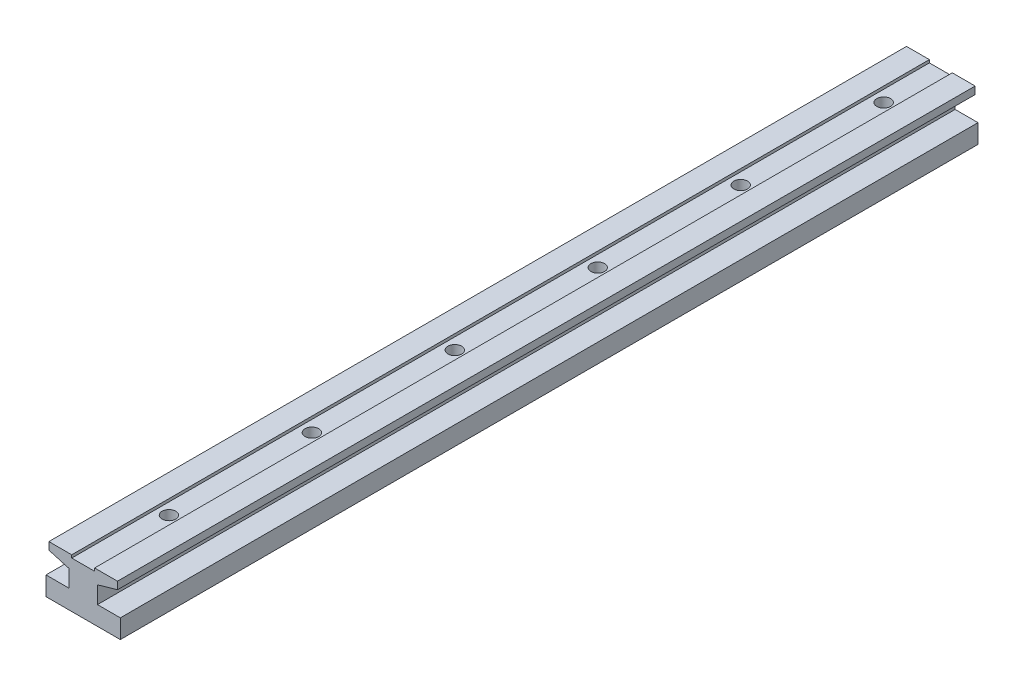
ISO-10303-21;
HEADER;
FILE_DESCRIPTION(('STEP AP214'),'2;1');
FILE_NAME('part.step','',(''),(''),'','','');
FILE_SCHEMA(('AUTOMOTIVE_DESIGN { 1 0 10303 214 1 1 1 1 }'));
ENDSEC;
DATA;
#1=APPLICATION_CONTEXT('core data for automotive mechanical design processes');
#2=APPLICATION_PROTOCOL_DEFINITION('international standard','automotive_design',2000,#1);
#3=PRODUCT_CONTEXT('',#1,'mechanical');
#4=PRODUCT('Part','Part','',(#3));
#5=PRODUCT_RELATED_PRODUCT_CATEGORY('part','',(#4));
#6=PRODUCT_DEFINITION_FORMATION('','',#4);
#7=PRODUCT_DEFINITION_CONTEXT('part definition',#1,'design');
#8=PRODUCT_DEFINITION('design','',#6,#7);
#9=PRODUCT_DEFINITION_SHAPE('','',#8);
#10=(LENGTH_UNIT() NAMED_UNIT(*) SI_UNIT(.MILLI.,.METRE.));
#11=(NAMED_UNIT(*) PLANE_ANGLE_UNIT() SI_UNIT($,.RADIAN.));
#12=(NAMED_UNIT(*) SI_UNIT($,.STERADIAN.) SOLID_ANGLE_UNIT());
#13=UNCERTAINTY_MEASURE_WITH_UNIT(LENGTH_MEASURE(1.E-05),#10,'distance_accuracy_value','');
#14=(GEOMETRIC_REPRESENTATION_CONTEXT(3) GLOBAL_UNCERTAINTY_ASSIGNED_CONTEXT((#13)) GLOBAL_UNIT_ASSIGNED_CONTEXT((#10,
#11,#12)) REPRESENTATION_CONTEXT('',''));
#15=CARTESIAN_POINT('',(0.,0.,0.));
#16=DIRECTION('',(0.,0.,1.));
#17=DIRECTION('',(1.,0.,0.));
#18=AXIS2_PLACEMENT_3D('',#15,#16,#17);
#19=CARTESIAN_POINT('',(6.5,0.,150.));
#20=DIRECTION('',(-1.,0.,0.));
#21=DIRECTION('',(0.,-1.,0.));
#22=AXIS2_PLACEMENT_3D('',#19,#20,#21);
#23=PLANE('',#22);
#24=DIRECTION('',(0.,1.,0.));
#25=VECTOR('',#24,1.);
#26=CARTESIAN_POINT('',(6.5,0.,0.));
#27=LINE('',#26,#25);
#28=CARTESIAN_POINT('',(6.5,0.,0.));
#29=VERTEX_POINT('',#28);
#30=CARTESIAN_POINT('',(6.5,3.3,0.));
#31=VERTEX_POINT('',#30);
#32=EDGE_CURVE('E182',#29,#31,#27,.T.);
#33=ORIENTED_EDGE('',*,*,#32,.T.);
#34=DIRECTION('',(0.,0.,-1.));
#35=VECTOR('',#34,1.);
#36=CARTESIAN_POINT('',(6.5,3.3,150.));
#37=LINE('',#36,#35);
#38=CARTESIAN_POINT('',(6.5,3.3,150.));
#39=VERTEX_POINT('',#38);
#40=EDGE_CURVE('E41',#39,#31,#37,.T.);
#41=ORIENTED_EDGE('',*,*,#40,.F.);
#42=DIRECTION('',(0.,1.,0.));
#43=VECTOR('',#42,1.);
#44=CARTESIAN_POINT('',(6.5,0.,150.));
#45=LINE('',#44,#43);
#46=CARTESIAN_POINT('',(6.5,0.,150.));
#47=VERTEX_POINT('',#46);
#48=EDGE_CURVE('E118',#47,#39,#45,.T.);
#49=ORIENTED_EDGE('',*,*,#48,.F.);
#50=DIRECTION('',(0.,0.,-1.));
#51=VECTOR('',#50,1.);
#52=CARTESIAN_POINT('',(6.5,0.,150.));
#53=LINE('',#52,#51);
#54=EDGE_CURVE('E11',#47,#29,#53,.T.);
#55=ORIENTED_EDGE('',*,*,#54,.T.);
#56=EDGE_LOOP('',(#33,#41,#49,#55));
#57=FACE_BOUND('',#56,.T.);
#58=ADVANCED_FACE('F32',(#57),#23,.F.);
#59=CARTESIAN_POINT('',(6.5,3.3,150.));
#60=DIRECTION('',(0.,-1.,0.));
#61=DIRECTION('',(1.,0.,0.));
#62=AXIS2_PLACEMENT_3D('',#59,#60,#61);
#63=PLANE('',#62);
#64=DIRECTION('',(-1.,0.,0.));
#65=VECTOR('',#64,1.);
#66=CARTESIAN_POINT('',(6.5,3.3,0.));
#67=LINE('',#66,#65);
#68=CARTESIAN_POINT('',(2.5,3.3,0.));
#69=VERTEX_POINT('',#68);
#70=EDGE_CURVE('E184',#31,#69,#67,.T.);
#71=ORIENTED_EDGE('',*,*,#70,.T.);
#72=DIRECTION('',(0.,0.,-1.));
#73=VECTOR('',#72,1.);
#74=CARTESIAN_POINT('',(2.5,3.3,150.));
#75=LINE('',#74,#73);
#76=CARTESIAN_POINT('',(2.5,3.3,150.));
#77=VERTEX_POINT('',#76);
#78=EDGE_CURVE('E242',#77,#69,#75,.T.);
#79=ORIENTED_EDGE('',*,*,#78,.F.);
#80=DIRECTION('',(-1.,0.,0.));
#81=VECTOR('',#80,1.);
#82=CARTESIAN_POINT('',(6.5,3.3,150.));
#83=LINE('',#82,#81);
#84=EDGE_CURVE('E310',#39,#77,#83,.T.);
#85=ORIENTED_EDGE('',*,*,#84,.F.);
#86=ORIENTED_EDGE('',*,*,#40,.T.);
#87=EDGE_LOOP('',(#71,#79,#85,#86));
#88=FACE_BOUND('',#87,.T.);
#89=ADVANCED_FACE('F349',(#88),#63,.F.);
#90=CARTESIAN_POINT('',(2.5,3.3,150.));
#91=DIRECTION('',(-1.,0.,0.));
#92=DIRECTION('',(0.,-1.,0.));
#93=AXIS2_PLACEMENT_3D('',#90,#91,#92);
#94=PLANE('',#93);
#95=DIRECTION('',(0.,1.,0.));
#96=VECTOR('',#95,1.);
#97=CARTESIAN_POINT('',(2.5,3.3,0.));
#98=LINE('',#97,#96);
#99=CARTESIAN_POINT('',(2.5,6.3,0.));
#100=VERTEX_POINT('',#99);
#101=EDGE_CURVE('E187',#69,#100,#98,.T.);
#102=ORIENTED_EDGE('',*,*,#101,.T.);
#103=DIRECTION('',(0.,0.,-1.));
#104=VECTOR('',#103,1.);
#105=CARTESIAN_POINT('',(2.5,6.3,150.));
#106=LINE('',#105,#104);
#107=CARTESIAN_POINT('',(2.5,6.3,150.));
#108=VERTEX_POINT('',#107);
#109=EDGE_CURVE('E239',#108,#100,#106,.T.);
#110=ORIENTED_EDGE('',*,*,#109,.F.);
#111=DIRECTION('',(0.,1.,0.));
#112=VECTOR('',#111,1.);
#113=CARTESIAN_POINT('',(2.5,3.3,150.));
#114=LINE('',#113,#112);
#115=EDGE_CURVE('E312',#77,#108,#114,.T.);
#116=ORIENTED_EDGE('',*,*,#115,.F.);
#117=ORIENTED_EDGE('',*,*,#78,.T.);
#118=EDGE_LOOP('',(#102,#110,#116,#117));
#119=FACE_BOUND('',#118,.T.);
#120=ADVANCED_FACE('F354',(#119),#94,.F.);
#121=CARTESIAN_POINT('',(2.5,6.3,150.));
#122=DIRECTION('',(-0.274721127897378,0.961523947640823,0.));
#123=DIRECTION('',(-0.961523947640823,-0.274721127897378,0.));
#124=AXIS2_PLACEMENT_3D('',#121,#122,#123);
#125=PLANE('',#124);
#126=DIRECTION('',(0.961523947640823,0.274721127897378,0.));
#127=VECTOR('',#126,1.);
#128=CARTESIAN_POINT('',(2.5,6.3,0.));
#129=LINE('',#128,#127);
#130=CARTESIAN_POINT('',(6.,7.3,0.));
#131=VERTEX_POINT('',#130);
#132=EDGE_CURVE('E189',#100,#131,#129,.T.);
#133=ORIENTED_EDGE('',*,*,#132,.T.);
#134=DIRECTION('',(0.,0.,-1.));
#135=VECTOR('',#134,1.);
#136=CARTESIAN_POINT('',(6.,7.3,150.));
#137=LINE('',#136,#135);
#138=CARTESIAN_POINT('',(6.,7.3,150.));
#139=VERTEX_POINT('',#138);
#140=EDGE_CURVE('E236',#139,#131,#137,.T.);
#141=ORIENTED_EDGE('',*,*,#140,.F.);
#142=DIRECTION('',(0.961523947640823,0.274721127897378,0.));
#143=VECTOR('',#142,1.);
#144=CARTESIAN_POINT('',(2.5,6.3,150.));
#145=LINE('',#144,#143);
#146=EDGE_CURVE('E314',#108,#139,#145,.T.);
#147=ORIENTED_EDGE('',*,*,#146,.F.);
#148=ORIENTED_EDGE('',*,*,#109,.T.);
#149=EDGE_LOOP('',(#133,#141,#147,#148));
#150=FACE_BOUND('',#149,.T.);
#151=ADVANCED_FACE('F360',(#150),#125,.F.);
#152=CARTESIAN_POINT('',(6.,7.3,150.));
#153=DIRECTION('',(-1.,0.,0.));
#154=DIRECTION('',(0.,0.,1.));
#155=AXIS2_PLACEMENT_3D('',#152,#153,#154);
#156=PLANE('',#155);
#157=DIRECTION('',(0.,1.,0.));
#158=VECTOR('',#157,1.);
#159=CARTESIAN_POINT('',(6.,7.3,0.));
#160=LINE('',#159,#158);
#161=CARTESIAN_POINT('',(6.,8.6,0.));
#162=VERTEX_POINT('',#161);
#163=EDGE_CURVE('E191',#131,#162,#160,.T.);
#164=ORIENTED_EDGE('',*,*,#163,.T.);
#165=DIRECTION('',(0.,0.,-1.));
#166=VECTOR('',#165,1.);
#167=CARTESIAN_POINT('',(6.,8.6,150.));
#168=LINE('',#167,#166);
#169=CARTESIAN_POINT('',(6.,8.6,150.));
#170=VERTEX_POINT('',#169);
#171=EDGE_CURVE('E233',#170,#162,#168,.T.);
#172=ORIENTED_EDGE('',*,*,#171,.F.);
#173=DIRECTION('',(0.,1.,0.));
#174=VECTOR('',#173,1.);
#175=CARTESIAN_POINT('',(6.,7.3,150.));
#176=LINE('',#175,#174);
#177=EDGE_CURVE('E316',#139,#170,#176,.T.);
#178=ORIENTED_EDGE('',*,*,#177,.F.);
#179=ORIENTED_EDGE('',*,*,#140,.T.);
#180=EDGE_LOOP('',(#164,#172,#178,#179));
#181=FACE_BOUND('',#180,.T.);
#182=ADVANCED_FACE('F364',(#181),#156,.F.);
#183=CARTESIAN_POINT('',(6.,8.6,150.));
#184=DIRECTION('',(0.,-1.,0.));
#185=DIRECTION('',(0.,0.,-1.));
#186=AXIS2_PLACEMENT_3D('',#183,#184,#185);
#187=PLANE('',#186);
#188=DIRECTION('',(-1.,0.,0.));
#189=VECTOR('',#188,1.);
#190=CARTESIAN_POINT('',(6.,8.6,0.));
#191=LINE('',#190,#189);
#192=CARTESIAN_POINT('',(2.,8.6,0.));
#193=VERTEX_POINT('',#192);
#194=EDGE_CURVE('E193',#162,#193,#191,.T.);
#195=ORIENTED_EDGE('',*,*,#194,.T.);
#196=DIRECTION('',(0.,0.,-1.));
#197=VECTOR('',#196,1.);
#198=CARTESIAN_POINT('',(2.,8.6,150.));
#199=LINE('',#198,#197);
#200=CARTESIAN_POINT('',(2.,8.6,150.));
#201=VERTEX_POINT('',#200);
#202=EDGE_CURVE('E230',#201,#193,#199,.T.);
#203=ORIENTED_EDGE('',*,*,#202,.F.);
#204=DIRECTION('',(-1.,0.,0.));
#205=VECTOR('',#204,1.);
#206=CARTESIAN_POINT('',(6.,8.6,150.));
#207=LINE('',#206,#205);
#208=EDGE_CURVE('E318',#170,#201,#207,.T.);
#209=ORIENTED_EDGE('',*,*,#208,.F.);
#210=ORIENTED_EDGE('',*,*,#171,.T.);
#211=EDGE_LOOP('',(#195,#203,#209,#210));
#212=FACE_BOUND('',#211,.T.);
#213=ADVANCED_FACE('F369',(#212),#187,.F.);
#214=CARTESIAN_POINT('',(2.,8.6,150.));
#215=DIRECTION('',(1.,0.,0.));
#216=DIRECTION('',(0.,0.,-1.));
#217=AXIS2_PLACEMENT_3D('',#214,#215,#216);
#218=PLANE('',#217);
#219=DIRECTION('',(0.,-1.,0.));
#220=VECTOR('',#219,1.);
#221=CARTESIAN_POINT('',(2.,8.6,0.));
#222=LINE('',#221,#220);
#223=CARTESIAN_POINT('',(2.,8.1,0.));
#224=VERTEX_POINT('',#223);
#225=EDGE_CURVE('E195',#193,#224,#222,.T.);
#226=ORIENTED_EDGE('',*,*,#225,.T.);
#227=DIRECTION('',(0.,0.,-1.));
#228=VECTOR('',#227,1.);
#229=CARTESIAN_POINT('',(2.,8.1,150.));
#230=LINE('',#229,#228);
#231=CARTESIAN_POINT('',(2.,8.1,150.));
#232=VERTEX_POINT('',#231);
#233=EDGE_CURVE('E227',#232,#224,#230,.T.);
#234=ORIENTED_EDGE('',*,*,#233,.F.);
#235=DIRECTION('',(0.,-1.,0.));
#236=VECTOR('',#235,1.);
#237=CARTESIAN_POINT('',(2.,8.6,150.));
#238=LINE('',#237,#236);
#239=EDGE_CURVE('E320',#201,#232,#238,.T.);
#240=ORIENTED_EDGE('',*,*,#239,.F.);
#241=ORIENTED_EDGE('',*,*,#202,.T.);
#242=EDGE_LOOP('',(#226,#234,#240,#241));
#243=FACE_BOUND('',#242,.T.);
#244=ADVANCED_FACE('F375',(#243),#218,.F.);
#245=CARTESIAN_POINT('',(-2.,8.1,150.));
#246=DIRECTION('',(0.,-1.,0.));
#247=DIRECTION('',(0.,0.,-1.));
#248=AXIS2_PLACEMENT_3D('',#245,#246,#247);
#249=PLANE('',#248);
#250=CARTESIAN_POINT('',(0.,8.1,85.));
#251=DIRECTION('',(0.,-1.,0.));
#252=DIRECTION('',(0.,0.,-1.));
#253=AXIS2_PLACEMENT_3D('',#250,#251,#252);
#254=CIRCLE('',#253,1.2);
#255=CARTESIAN_POINT('',(0.,8.1,83.8));
#256=VERTEX_POINT('',#255);
#257=EDGE_CURVE('E35',#256,#256,#254,.T.);
#258=ORIENTED_EDGE('',*,*,#257,.T.);
#259=EDGE_LOOP('',(#258));
#260=FACE_BOUND('',#259,.T.);
#261=CARTESIAN_POINT('',(0.,8.1,60.));
#262=DIRECTION('',(0.,-1.,0.));
#263=DIRECTION('',(0.,0.,-1.));
#264=AXIS2_PLACEMENT_3D('',#261,#262,#263);
#265=CIRCLE('',#264,1.2);
#266=CARTESIAN_POINT('',(0.,8.1,58.8));
#267=VERTEX_POINT('',#266);
#268=EDGE_CURVE('E264',#267,#267,#265,.T.);
#269=ORIENTED_EDGE('',*,*,#268,.T.);
#270=EDGE_LOOP('',(#269));
#271=FACE_BOUND('',#270,.T.);
#272=CARTESIAN_POINT('',(0.,8.1,35.));
#273=DIRECTION('',(0.,-1.,0.));
#274=DIRECTION('',(0.,0.,-1.));
#275=AXIS2_PLACEMENT_3D('',#272,#273,#274);
#276=CIRCLE('',#275,1.2);
#277=CARTESIAN_POINT('',(0.,8.1,33.8));
#278=VERTEX_POINT('',#277);
#279=EDGE_CURVE('E260',#278,#278,#276,.T.);
#280=ORIENTED_EDGE('',*,*,#279,.T.);
#281=EDGE_LOOP('',(#280));
#282=FACE_BOUND('',#281,.T.);
#283=CARTESIAN_POINT('',(0.,8.1,10.));
#284=DIRECTION('',(0.,-1.,0.));
#285=DIRECTION('',(0.,0.,-1.));
#286=AXIS2_PLACEMENT_3D('',#283,#284,#285);
#287=CIRCLE('',#286,1.2);
#288=CARTESIAN_POINT('',(0.,8.1,8.8));
#289=VERTEX_POINT('',#288);
#290=EDGE_CURVE('E255',#289,#289,#287,.T.);
#291=ORIENTED_EDGE('',*,*,#290,.T.);
#292=EDGE_LOOP('',(#291));
#293=FACE_BOUND('',#292,.T.);
#294=CARTESIAN_POINT('',(0.,8.1,110.));
#295=DIRECTION('',(0.,-1.,0.));
#296=DIRECTION('',(0.,0.,-1.));
#297=AXIS2_PLACEMENT_3D('',#294,#295,#296);
#298=CIRCLE('',#297,1.2);
#299=CARTESIAN_POINT('',(0.,8.1,108.8));
#300=VERTEX_POINT('',#299);
#301=EDGE_CURVE('E250',#300,#300,#298,.T.);
#302=ORIENTED_EDGE('',*,*,#301,.T.);
#303=EDGE_LOOP('',(#302));
#304=FACE_BOUND('',#303,.T.);
#305=CARTESIAN_POINT('',(0.,8.1,135.));
#306=DIRECTION('',(0.,-1.,0.));
#307=DIRECTION('',(0.,0.,-1.));
#308=AXIS2_PLACEMENT_3D('',#305,#306,#307);
#309=CIRCLE('',#308,1.2);
#310=CARTESIAN_POINT('',(0.,8.1,133.8));
#311=VERTEX_POINT('',#310);
#312=EDGE_CURVE('E185',#311,#311,#309,.T.);
#313=ORIENTED_EDGE('',*,*,#312,.T.);
#314=EDGE_LOOP('',(#313));
#315=FACE_BOUND('',#314,.T.);
#316=DIRECTION('',(-1.,0.,0.));
#317=VECTOR('',#316,1.);
#318=CARTESIAN_POINT('',(-2.,8.1,0.));
#319=LINE('',#318,#317);
#320=CARTESIAN_POINT('',(-2.,8.1,0.));
#321=VERTEX_POINT('',#320);
#322=EDGE_CURVE('E197',#224,#321,#319,.T.);
#323=ORIENTED_EDGE('',*,*,#322,.T.);
#324=DIRECTION('',(0.,0.,-1.));
#325=VECTOR('',#324,1.);
#326=CARTESIAN_POINT('',(-2.,8.1,150.));
#327=LINE('',#326,#325);
#328=CARTESIAN_POINT('',(-2.,8.1,150.));
#329=VERTEX_POINT('',#328);
#330=EDGE_CURVE('E224',#329,#321,#327,.T.);
#331=ORIENTED_EDGE('',*,*,#330,.F.);
#332=DIRECTION('',(-1.,0.,0.));
#333=VECTOR('',#332,1.);
#334=CARTESIAN_POINT('',(-2.,8.1,150.));
#335=LINE('',#334,#333);
#336=EDGE_CURVE('E322',#232,#329,#335,.T.);
#337=ORIENTED_EDGE('',*,*,#336,.F.);
#338=ORIENTED_EDGE('',*,*,#233,.T.);
#339=EDGE_LOOP('',(#323,#331,#337,#338));
#340=FACE_BOUND('',#339,.T.);
#341=ADVANCED_FACE('F379',(#260,#271,#282,#293,#304,#315,#340),#249,.F.);
#342=CARTESIAN_POINT('',(-2.,8.6,150.));
#343=DIRECTION('',(-1.,0.,0.));
#344=DIRECTION('',(0.,0.,1.));
#345=AXIS2_PLACEMENT_3D('',#342,#343,#344);
#346=PLANE('',#345);
#347=DIRECTION('',(0.,1.,0.));
#348=VECTOR('',#347,1.);
#349=CARTESIAN_POINT('',(-2.,8.6,0.));
#350=LINE('',#349,#348);
#351=CARTESIAN_POINT('',(-2.,8.6,0.));
#352=VERTEX_POINT('',#351);
#353=EDGE_CURVE('E199',#321,#352,#350,.T.);
#354=ORIENTED_EDGE('',*,*,#353,.T.);
#355=DIRECTION('',(0.,0.,-1.));
#356=VECTOR('',#355,1.);
#357=CARTESIAN_POINT('',(-2.,8.6,150.));
#358=LINE('',#357,#356);
#359=CARTESIAN_POINT('',(-2.,8.6,150.));
#360=VERTEX_POINT('',#359);
#361=EDGE_CURVE('E221',#360,#352,#358,.T.);
#362=ORIENTED_EDGE('',*,*,#361,.F.);
#363=DIRECTION('',(0.,1.,0.));
#364=VECTOR('',#363,1.);
#365=CARTESIAN_POINT('',(-2.,8.6,150.));
#366=LINE('',#365,#364);
#367=EDGE_CURVE('E324',#329,#360,#366,.T.);
#368=ORIENTED_EDGE('',*,*,#367,.F.);
#369=ORIENTED_EDGE('',*,*,#330,.T.);
#370=EDGE_LOOP('',(#354,#362,#368,#369));
#371=FACE_BOUND('',#370,.T.);
#372=ADVANCED_FACE('F384',(#371),#346,.F.);
#373=CARTESIAN_POINT('',(-6.,8.6,150.));
#374=DIRECTION('',(0.,-1.,0.));
#375=DIRECTION('',(0.,0.,-1.));
#376=AXIS2_PLACEMENT_3D('',#373,#374,#375);
#377=PLANE('',#376);
#378=DIRECTION('',(-1.,0.,0.));
#379=VECTOR('',#378,1.);
#380=CARTESIAN_POINT('',(-6.,8.6,0.));
#381=LINE('',#380,#379);
#382=CARTESIAN_POINT('',(-6.,8.6,0.));
#383=VERTEX_POINT('',#382);
#384=EDGE_CURVE('E201',#352,#383,#381,.T.);
#385=ORIENTED_EDGE('',*,*,#384,.T.);
#386=DIRECTION('',(0.,0.,-1.));
#387=VECTOR('',#386,1.);
#388=CARTESIAN_POINT('',(-6.,8.6,150.));
#389=LINE('',#388,#387);
#390=CARTESIAN_POINT('',(-6.,8.6,150.));
#391=VERTEX_POINT('',#390);
#392=EDGE_CURVE('E218',#391,#383,#389,.T.);
#393=ORIENTED_EDGE('',*,*,#392,.F.);
#394=DIRECTION('',(-1.,0.,0.));
#395=VECTOR('',#394,1.);
#396=CARTESIAN_POINT('',(-6.,8.6,150.));
#397=LINE('',#396,#395);
#398=EDGE_CURVE('E326',#360,#391,#397,.T.);
#399=ORIENTED_EDGE('',*,*,#398,.F.);
#400=ORIENTED_EDGE('',*,*,#361,.T.);
#401=EDGE_LOOP('',(#385,#393,#399,#400));
#402=FACE_BOUND('',#401,.T.);
#403=ADVANCED_FACE('F387',(#402),#377,.F.);
#404=CARTESIAN_POINT('',(-6.,7.3,150.));
#405=DIRECTION('',(1.,0.,0.));
#406=DIRECTION('',(0.,0.,-1.));
#407=AXIS2_PLACEMENT_3D('',#404,#405,#406);
#408=PLANE('',#407);
#409=DIRECTION('',(0.,-1.,0.));
#410=VECTOR('',#409,1.);
#411=CARTESIAN_POINT('',(-6.,7.3,0.));
#412=LINE('',#411,#410);
#413=CARTESIAN_POINT('',(-6.,7.3,0.));
#414=VERTEX_POINT('',#413);
#415=EDGE_CURVE('E203',#383,#414,#412,.T.);
#416=ORIENTED_EDGE('',*,*,#415,.T.);
#417=DIRECTION('',(0.,0.,-1.));
#418=VECTOR('',#417,1.);
#419=CARTESIAN_POINT('',(-6.,7.3,150.));
#420=LINE('',#419,#418);
#421=CARTESIAN_POINT('',(-6.,7.3,150.));
#422=VERTEX_POINT('',#421);
#423=EDGE_CURVE('E215',#422,#414,#420,.T.);
#424=ORIENTED_EDGE('',*,*,#423,.F.);
#425=DIRECTION('',(0.,-1.,0.));
#426=VECTOR('',#425,1.);
#427=CARTESIAN_POINT('',(-6.,7.3,150.));
#428=LINE('',#427,#426);
#429=EDGE_CURVE('E328',#391,#422,#428,.T.);
#430=ORIENTED_EDGE('',*,*,#429,.F.);
#431=ORIENTED_EDGE('',*,*,#392,.T.);
#432=EDGE_LOOP('',(#416,#424,#430,#431));
#433=FACE_BOUND('',#432,.T.);
#434=ADVANCED_FACE('F334',(#433),#408,.F.);
#435=CARTESIAN_POINT('',(-2.5,6.3,150.));
#436=DIRECTION('',(0.274721127897378,0.961523947640823,0.));
#437=DIRECTION('',(-0.961523947640823,0.274721127897378,0.));
#438=AXIS2_PLACEMENT_3D('',#435,#436,#437);
#439=PLANE('',#438);
#440=DIRECTION('',(0.961523947640823,-0.274721127897378,0.));
#441=VECTOR('',#440,1.);
#442=CARTESIAN_POINT('',(-2.5,6.3,0.));
#443=LINE('',#442,#441);
#444=CARTESIAN_POINT('',(-2.5,6.3,0.));
#445=VERTEX_POINT('',#444);
#446=EDGE_CURVE('E205',#414,#445,#443,.T.);
#447=ORIENTED_EDGE('',*,*,#446,.T.);
#448=DIRECTION('',(0.,0.,-1.));
#449=VECTOR('',#448,1.);
#450=CARTESIAN_POINT('',(-2.5,6.3,150.));
#451=LINE('',#450,#449);
#452=CARTESIAN_POINT('',(-2.5,6.3,150.));
#453=VERTEX_POINT('',#452);
#454=EDGE_CURVE('E171',#453,#445,#451,.T.);
#455=ORIENTED_EDGE('',*,*,#454,.F.);
#456=DIRECTION('',(0.961523947640823,-0.274721127897378,0.));
#457=VECTOR('',#456,1.);
#458=CARTESIAN_POINT('',(-2.5,6.3,150.));
#459=LINE('',#458,#457);
#460=EDGE_CURVE('E162',#422,#453,#459,.T.);
#461=ORIENTED_EDGE('',*,*,#460,.F.);
#462=ORIENTED_EDGE('',*,*,#423,.T.);
#463=EDGE_LOOP('',(#447,#455,#461,#462));
#464=FACE_BOUND('',#463,.T.);
#465=ADVANCED_FACE('F338',(#464),#439,.F.);
#466=CARTESIAN_POINT('',(-2.5,3.3,150.));
#467=DIRECTION('',(1.,0.,0.));
#468=DIRECTION('',(0.,1.,0.));
#469=AXIS2_PLACEMENT_3D('',#466,#467,#468);
#470=PLANE('',#469);
#471=DIRECTION('',(0.,-1.,0.));
#472=VECTOR('',#471,1.);
#473=CARTESIAN_POINT('',(-2.5,3.3,0.));
#474=LINE('',#473,#472);
#475=CARTESIAN_POINT('',(-2.5,3.3,0.));
#476=VERTEX_POINT('',#475);
#477=EDGE_CURVE('E170',#445,#476,#474,.T.);
#478=ORIENTED_EDGE('',*,*,#477,.T.);
#479=DIRECTION('',(0.,0.,-1.));
#480=VECTOR('',#479,1.);
#481=CARTESIAN_POINT('',(-2.5,3.3,150.));
#482=LINE('',#481,#480);
#483=CARTESIAN_POINT('',(-2.5,3.3,150.));
#484=VERTEX_POINT('',#483);
#485=EDGE_CURVE('E167',#484,#476,#482,.T.);
#486=ORIENTED_EDGE('',*,*,#485,.F.);
#487=DIRECTION('',(0.,-1.,0.));
#488=VECTOR('',#487,1.);
#489=CARTESIAN_POINT('',(-2.5,3.3,150.));
#490=LINE('',#489,#488);
#491=EDGE_CURVE('E156',#453,#484,#490,.T.);
#492=ORIENTED_EDGE('',*,*,#491,.F.);
#493=ORIENTED_EDGE('',*,*,#454,.T.);
#494=EDGE_LOOP('',(#478,#486,#492,#493));
#495=FACE_BOUND('',#494,.T.);
#496=ADVANCED_FACE('F168',(#495),#470,.F.);
#497=CARTESIAN_POINT('',(-6.5,3.3,150.));
#498=DIRECTION('',(0.,-1.,0.));
#499=DIRECTION('',(1.,0.,0.));
#500=AXIS2_PLACEMENT_3D('',#497,#498,#499);
#501=PLANE('',#500);
#502=DIRECTION('',(-1.,0.,0.));
#503=VECTOR('',#502,1.);
#504=CARTESIAN_POINT('',(-6.5,3.3,0.));
#505=LINE('',#504,#503);
#506=CARTESIAN_POINT('',(-6.5,3.3,0.));
#507=VERTEX_POINT('',#506);
#508=EDGE_CURVE('E104',#476,#507,#505,.T.);
#509=ORIENTED_EDGE('',*,*,#508,.T.);
#510=DIRECTION('',(0.,0.,-1.));
#511=VECTOR('',#510,1.);
#512=CARTESIAN_POINT('',(-6.5,3.3,150.));
#513=LINE('',#512,#511);
#514=CARTESIAN_POINT('',(-6.5,3.3,150.));
#515=VERTEX_POINT('',#514);
#516=EDGE_CURVE('E172',#515,#507,#513,.T.);
#517=ORIENTED_EDGE('',*,*,#516,.F.);
#518=DIRECTION('',(-1.,0.,0.));
#519=VECTOR('',#518,1.);
#520=CARTESIAN_POINT('',(-6.5,3.3,150.));
#521=LINE('',#520,#519);
#522=EDGE_CURVE('E160',#484,#515,#521,.T.);
#523=ORIENTED_EDGE('',*,*,#522,.F.);
#524=ORIENTED_EDGE('',*,*,#485,.T.);
#525=EDGE_LOOP('',(#509,#517,#523,#524));
#526=FACE_BOUND('',#525,.T.);
#527=ADVANCED_FACE('F174',(#526),#501,.F.);
#528=CARTESIAN_POINT('',(-6.5,0.,150.));
#529=DIRECTION('',(1.,0.,0.));
#530=DIRECTION('',(0.,0.,-1.));
#531=AXIS2_PLACEMENT_3D('',#528,#529,#530);
#532=PLANE('',#531);
#533=DIRECTION('',(0.,-1.,0.));
#534=VECTOR('',#533,1.);
#535=CARTESIAN_POINT('',(-6.5,0.,0.));
#536=LINE('',#535,#534);
#537=CARTESIAN_POINT('',(-6.5,0.,0.));
#538=VERTEX_POINT('',#537);
#539=EDGE_CURVE('E111',#507,#538,#536,.T.);
#540=ORIENTED_EDGE('',*,*,#539,.T.);
#541=DIRECTION('',(0.,0.,-1.));
#542=VECTOR('',#541,1.);
#543=CARTESIAN_POINT('',(-6.5,0.,150.));
#544=LINE('',#543,#542);
#545=CARTESIAN_POINT('',(-6.5,0.,150.));
#546=VERTEX_POINT('',#545);
#547=EDGE_CURVE('E178',#546,#538,#544,.T.);
#548=ORIENTED_EDGE('',*,*,#547,.F.);
#549=DIRECTION('',(0.,-1.,0.));
#550=VECTOR('',#549,1.);
#551=CARTESIAN_POINT('',(-6.5,0.,150.));
#552=LINE('',#551,#550);
#553=EDGE_CURVE('E176',#515,#546,#552,.T.);
#554=ORIENTED_EDGE('',*,*,#553,.F.);
#555=ORIENTED_EDGE('',*,*,#516,.T.);
#556=EDGE_LOOP('',(#540,#548,#554,#555));
#557=FACE_BOUND('',#556,.T.);
#558=ADVANCED_FACE('F345',(#557),#532,.F.);
#559=CARTESIAN_POINT('',(0.,0.,150.));
#560=DIRECTION('',(0.,1.,0.));
#561=DIRECTION('',(-1.,0.,0.));
#562=AXIS2_PLACEMENT_3D('',#559,#560,#561);
#563=PLANE('',#562);
#564=CARTESIAN_POINT('',(0.,0.,85.));
#565=DIRECTION('',(0.,-1.,0.));
#566=DIRECTION('',(0.,0.,-1.));
#567=AXIS2_PLACEMENT_3D('',#564,#565,#566);
#568=CIRCLE('',#567,2.5);
#569=CARTESIAN_POINT('',(0.,0.,82.5));
#570=VERTEX_POINT('',#569);
#571=EDGE_CURVE('E731',#570,#570,#568,.T.);
#572=ORIENTED_EDGE('',*,*,#571,.F.);
#573=EDGE_LOOP('',(#572));
#574=FACE_BOUND('',#573,.T.);
#575=CARTESIAN_POINT('',(0.,0.,60.));
#576=DIRECTION('',(0.,-1.,0.));
#577=DIRECTION('',(0.,0.,-1.));
#578=AXIS2_PLACEMENT_3D('',#575,#576,#577);
#579=CIRCLE('',#578,2.5);
#580=CARTESIAN_POINT('',(0.,0.,57.5));
#581=VERTEX_POINT('',#580);
#582=EDGE_CURVE('E279',#581,#581,#579,.T.);
#583=ORIENTED_EDGE('',*,*,#582,.F.);
#584=EDGE_LOOP('',(#583));
#585=FACE_BOUND('',#584,.T.);
#586=CARTESIAN_POINT('',(0.,0.,35.));
#587=DIRECTION('',(0.,-1.,0.));
#588=DIRECTION('',(0.,0.,-1.));
#589=AXIS2_PLACEMENT_3D('',#586,#587,#588);
#590=CIRCLE('',#589,2.5);
#591=CARTESIAN_POINT('',(0.,0.,32.5));
#592=VERTEX_POINT('',#591);
#593=EDGE_CURVE('E266',#592,#592,#590,.T.);
#594=ORIENTED_EDGE('',*,*,#593,.F.);
#595=EDGE_LOOP('',(#594));
#596=FACE_BOUND('',#595,.T.);
#597=CARTESIAN_POINT('',(0.,0.,10.));
#598=DIRECTION('',(0.,-1.,0.));
#599=DIRECTION('',(0.,0.,-1.));
#600=AXIS2_PLACEMENT_3D('',#597,#598,#599);
#601=CIRCLE('',#600,2.5);
#602=CARTESIAN_POINT('',(0.,0.,7.5));
#603=VERTEX_POINT('',#602);
#604=EDGE_CURVE('E262',#603,#603,#601,.T.);
#605=ORIENTED_EDGE('',*,*,#604,.F.);
#606=EDGE_LOOP('',(#605));
#607=FACE_BOUND('',#606,.T.);
#608=CARTESIAN_POINT('',(0.,0.,110.));
#609=DIRECTION('',(0.,-1.,0.));
#610=DIRECTION('',(0.,0.,-1.));
#611=AXIS2_PLACEMENT_3D('',#608,#609,#610);
#612=CIRCLE('',#611,2.5);
#613=CARTESIAN_POINT('',(0.,0.,107.5));
#614=VERTEX_POINT('',#613);
#615=EDGE_CURVE('E258',#614,#614,#612,.T.);
#616=ORIENTED_EDGE('',*,*,#615,.F.);
#617=EDGE_LOOP('',(#616));
#618=FACE_BOUND('',#617,.T.);
#619=CARTESIAN_POINT('',(0.,0.,135.));
#620=DIRECTION('',(0.,-1.,0.));
#621=DIRECTION('',(0.,0.,-1.));
#622=AXIS2_PLACEMENT_3D('',#619,#620,#621);
#623=CIRCLE('',#622,2.5);
#624=CARTESIAN_POINT('',(0.,0.,132.5));
#625=VERTEX_POINT('',#624);
#626=EDGE_CURVE('E253',#625,#625,#623,.T.);
#627=ORIENTED_EDGE('',*,*,#626,.F.);
#628=EDGE_LOOP('',(#627));
#629=FACE_BOUND('',#628,.T.);
#630=DIRECTION('',(1.,0.,0.));
#631=VECTOR('',#630,1.);
#632=CARTESIAN_POINT('',(0.,0.,0.));
#633=LINE('',#632,#631);
#634=EDGE_CURVE('E210',#538,#29,#633,.T.);
#635=ORIENTED_EDGE('',*,*,#634,.T.);
#636=ORIENTED_EDGE('',*,*,#54,.F.);
#637=DIRECTION('',(1.,0.,0.));
#638=VECTOR('',#637,1.);
#639=CARTESIAN_POINT('',(0.,0.,150.));
#640=LINE('',#639,#638);
#641=EDGE_CURVE('E50',#546,#47,#640,.T.);
#642=ORIENTED_EDGE('',*,*,#641,.F.);
#643=ORIENTED_EDGE('',*,*,#547,.T.);
#644=EDGE_LOOP('',(#635,#636,#642,#643));
#645=FACE_BOUND('',#644,.T.);
#646=ADVANCED_FACE('F344',(#574,#585,#596,#607,#618,#629,#645),#563,.F.);
#647=CARTESIAN_POINT('',(0.,0.,150.));
#648=DIRECTION('',(0.,0.,1.));
#649=DIRECTION('',(1.,0.,0.));
#650=AXIS2_PLACEMENT_3D('',#647,#648,#649);
#651=PLANE('',#650);
#652=ORIENTED_EDGE('',*,*,#641,.T.);
#653=ORIENTED_EDGE('',*,*,#48,.T.);
#654=ORIENTED_EDGE('',*,*,#84,.T.);
#655=ORIENTED_EDGE('',*,*,#115,.T.);
#656=ORIENTED_EDGE('',*,*,#146,.T.);
#657=ORIENTED_EDGE('',*,*,#177,.T.);
#658=ORIENTED_EDGE('',*,*,#208,.T.);
#659=ORIENTED_EDGE('',*,*,#239,.T.);
#660=ORIENTED_EDGE('',*,*,#336,.T.);
#661=ORIENTED_EDGE('',*,*,#367,.T.);
#662=ORIENTED_EDGE('',*,*,#398,.T.);
#663=ORIENTED_EDGE('',*,*,#429,.T.);
#664=ORIENTED_EDGE('',*,*,#460,.T.);
#665=ORIENTED_EDGE('',*,*,#491,.T.);
#666=ORIENTED_EDGE('',*,*,#522,.T.);
#667=ORIENTED_EDGE('',*,*,#553,.T.);
#668=EDGE_LOOP('',(#652,#653,#654,#655,#656,#657,#658,#659,#660,#661,#662,#663,#664,#665,#666,#667));
#669=FACE_BOUND('',#668,.T.);
#670=ADVANCED_FACE('F158',(#669),#651,.T.);
#671=CARTESIAN_POINT('',(0.,0.,0.));
#672=DIRECTION('',(0.,0.,1.));
#673=DIRECTION('',(1.,0.,0.));
#674=AXIS2_PLACEMENT_3D('',#671,#672,#673);
#675=PLANE('',#674);
#676=ORIENTED_EDGE('',*,*,#32,.F.);
#677=ORIENTED_EDGE('',*,*,#634,.F.);
#678=ORIENTED_EDGE('',*,*,#539,.F.);
#679=ORIENTED_EDGE('',*,*,#508,.F.);
#680=ORIENTED_EDGE('',*,*,#477,.F.);
#681=ORIENTED_EDGE('',*,*,#446,.F.);
#682=ORIENTED_EDGE('',*,*,#415,.F.);
#683=ORIENTED_EDGE('',*,*,#384,.F.);
#684=ORIENTED_EDGE('',*,*,#353,.F.);
#685=ORIENTED_EDGE('',*,*,#322,.F.);
#686=ORIENTED_EDGE('',*,*,#225,.F.);
#687=ORIENTED_EDGE('',*,*,#194,.F.);
#688=ORIENTED_EDGE('',*,*,#163,.F.);
#689=ORIENTED_EDGE('',*,*,#132,.F.);
#690=ORIENTED_EDGE('',*,*,#101,.F.);
#691=ORIENTED_EDGE('',*,*,#70,.F.);
#692=EDGE_LOOP('',(#676,#677,#678,#679,#680,#681,#682,#683,#684,#685,#686,#687,#688,#689,#690,#691));
#693=FACE_BOUND('',#692,.T.);
#694=ADVANCED_FACE('F341',(#693),#675,.F.);
#695=CARTESIAN_POINT('',(0.,0.,135.));
#696=DIRECTION('',(0.,-1.,0.));
#697=DIRECTION('',(0.,0.,-1.));
#698=AXIS2_PLACEMENT_3D('',#695,#696,#697);
#699=CYLINDRICAL_SURFACE('',#698,1.2);
#700=CARTESIAN_POINT('',(0.,1.6,135.));
#701=DIRECTION('',(0.,-1.,0.));
#702=DIRECTION('',(0.,0.,-1.));
#703=AXIS2_PLACEMENT_3D('',#700,#701,#702);
#704=CIRCLE('',#703,1.2);
#705=CARTESIAN_POINT('',(0.,1.6,133.8));
#706=VERTEX_POINT('',#705);
#707=EDGE_CURVE('E249',#706,#706,#704,.T.);
#708=ORIENTED_EDGE('',*,*,#707,.T.);
#709=EDGE_LOOP('',(#708));
#710=FACE_BOUND('',#709,.T.);
#711=ORIENTED_EDGE('',*,*,#312,.F.);
#712=EDGE_LOOP('',(#711));
#713=FACE_BOUND('',#712,.T.);
#714=ADVANCED_FACE('F428',(#710,#713),#699,.F.);
#715=CARTESIAN_POINT('',(1.2,1.6,135.));
#716=DIRECTION('',(0.,1.,0.));
#717=DIRECTION('',(0.,0.,1.));
#718=AXIS2_PLACEMENT_3D('',#715,#716,#717);
#719=PLANE('',#718);
#720=ORIENTED_EDGE('',*,*,#707,.F.);
#721=EDGE_LOOP('',(#720));
#722=FACE_BOUND('',#721,.T.);
#723=CARTESIAN_POINT('',(0.,1.6,135.));
#724=DIRECTION('',(0.,-1.,0.));
#725=DIRECTION('',(0.,0.,-1.));
#726=AXIS2_PLACEMENT_3D('',#723,#724,#725);
#727=CIRCLE('',#726,2.5);
#728=CARTESIAN_POINT('',(0.,1.6,132.5));
#729=VERTEX_POINT('',#728);
#730=EDGE_CURVE('E303',#729,#729,#727,.T.);
#731=ORIENTED_EDGE('',*,*,#730,.T.);
#732=EDGE_LOOP('',(#731));
#733=FACE_BOUND('',#732,.T.);
#734=ADVANCED_FACE('F430',(#722,#733),#719,.F.);
#735=CARTESIAN_POINT('',(0.,0.,135.));
#736=DIRECTION('',(0.,-1.,0.));
#737=DIRECTION('',(0.,0.,-1.));
#738=AXIS2_PLACEMENT_3D('',#735,#736,#737);
#739=CYLINDRICAL_SURFACE('',#738,2.5);
#740=ORIENTED_EDGE('',*,*,#730,.F.);
#741=EDGE_LOOP('',(#740));
#742=FACE_BOUND('',#741,.T.);
#743=ORIENTED_EDGE('',*,*,#626,.T.);
#744=EDGE_LOOP('',(#743));
#745=FACE_BOUND('',#744,.T.);
#746=ADVANCED_FACE('F437',(#742,#745),#739,.F.);
#747=CARTESIAN_POINT('',(0.,0.,110.));
#748=DIRECTION('',(0.,-1.,0.));
#749=DIRECTION('',(0.,0.,-1.));
#750=AXIS2_PLACEMENT_3D('',#747,#748,#749);
#751=CYLINDRICAL_SURFACE('',#750,1.2);
#752=CARTESIAN_POINT('',(0.,1.6,110.));
#753=DIRECTION('',(0.,-1.,0.));
#754=DIRECTION('',(0.,0.,-1.));
#755=AXIS2_PLACEMENT_3D('',#752,#753,#754);
#756=CIRCLE('',#755,1.2);
#757=CARTESIAN_POINT('',(0.,1.6,108.8));
#758=VERTEX_POINT('',#757);
#759=EDGE_CURVE('E254',#758,#758,#756,.T.);
#760=ORIENTED_EDGE('',*,*,#759,.T.);
#761=EDGE_LOOP('',(#760));
#762=FACE_BOUND('',#761,.T.);
#763=ORIENTED_EDGE('',*,*,#301,.F.);
#764=EDGE_LOOP('',(#763));
#765=FACE_BOUND('',#764,.T.);
#766=ADVANCED_FACE('F573',(#762,#765),#751,.F.);
#767=CARTESIAN_POINT('',(1.2,1.6,110.));
#768=DIRECTION('',(0.,1.,0.));
#769=DIRECTION('',(0.,0.,1.));
#770=AXIS2_PLACEMENT_3D('',#767,#768,#769);
#771=PLANE('',#770);
#772=ORIENTED_EDGE('',*,*,#759,.F.);
#773=EDGE_LOOP('',(#772));
#774=FACE_BOUND('',#773,.T.);
#775=CARTESIAN_POINT('',(0.,1.6,110.));
#776=DIRECTION('',(0.,-1.,0.));
#777=DIRECTION('',(0.,0.,-1.));
#778=AXIS2_PLACEMENT_3D('',#775,#776,#777);
#779=CIRCLE('',#778,2.5);
#780=CARTESIAN_POINT('',(0.,1.6,107.5));
#781=VERTEX_POINT('',#780);
#782=EDGE_CURVE('E296',#781,#781,#779,.T.);
#783=ORIENTED_EDGE('',*,*,#782,.T.);
#784=EDGE_LOOP('',(#783));
#785=FACE_BOUND('',#784,.T.);
#786=ADVANCED_FACE('F581',(#774,#785),#771,.F.);
#787=CARTESIAN_POINT('',(0.,0.,110.));
#788=DIRECTION('',(0.,-1.,0.));
#789=DIRECTION('',(0.,0.,-1.));
#790=AXIS2_PLACEMENT_3D('',#787,#788,#789);
#791=CYLINDRICAL_SURFACE('',#790,2.5);
#792=ORIENTED_EDGE('',*,*,#782,.F.);
#793=EDGE_LOOP('',(#792));
#794=FACE_BOUND('',#793,.T.);
#795=ORIENTED_EDGE('',*,*,#615,.T.);
#796=EDGE_LOOP('',(#795));
#797=FACE_BOUND('',#796,.T.);
#798=ADVANCED_FACE('F590',(#794,#797),#791,.F.);
#799=CARTESIAN_POINT('',(0.,0.,10.));
#800=DIRECTION('',(0.,-1.,0.));
#801=DIRECTION('',(0.,0.,-1.));
#802=AXIS2_PLACEMENT_3D('',#799,#800,#801);
#803=CYLINDRICAL_SURFACE('',#802,1.2);
#804=CARTESIAN_POINT('',(0.,1.6,10.));
#805=DIRECTION('',(0.,-1.,0.));
#806=DIRECTION('',(0.,0.,-1.));
#807=AXIS2_PLACEMENT_3D('',#804,#805,#806);
#808=CIRCLE('',#807,1.2);
#809=CARTESIAN_POINT('',(0.,1.6,8.8));
#810=VERTEX_POINT('',#809);
#811=EDGE_CURVE('E259',#810,#810,#808,.T.);
#812=ORIENTED_EDGE('',*,*,#811,.T.);
#813=EDGE_LOOP('',(#812));
#814=FACE_BOUND('',#813,.T.);
#815=ORIENTED_EDGE('',*,*,#290,.F.);
#816=EDGE_LOOP('',(#815));
#817=FACE_BOUND('',#816,.T.);
#818=ADVANCED_FACE('F599',(#814,#817),#803,.F.);
#819=CARTESIAN_POINT('',(1.2,1.6,10.));
#820=DIRECTION('',(0.,1.,0.));
#821=DIRECTION('',(0.,0.,1.));
#822=AXIS2_PLACEMENT_3D('',#819,#820,#821);
#823=PLANE('',#822);
#824=ORIENTED_EDGE('',*,*,#811,.F.);
#825=EDGE_LOOP('',(#824));
#826=FACE_BOUND('',#825,.T.);
#827=CARTESIAN_POINT('',(0.,1.6,10.));
#828=DIRECTION('',(0.,-1.,0.));
#829=DIRECTION('',(0.,0.,-1.));
#830=AXIS2_PLACEMENT_3D('',#827,#828,#829);
#831=CIRCLE('',#830,2.5);
#832=CARTESIAN_POINT('',(0.,1.6,7.5));
#833=VERTEX_POINT('',#832);
#834=EDGE_CURVE('E289',#833,#833,#831,.T.);
#835=ORIENTED_EDGE('',*,*,#834,.T.);
#836=EDGE_LOOP('',(#835));
#837=FACE_BOUND('',#836,.T.);
#838=ADVANCED_FACE('F608',(#826,#837),#823,.F.);
#839=CARTESIAN_POINT('',(0.,0.,10.));
#840=DIRECTION('',(0.,-1.,0.));
#841=DIRECTION('',(0.,0.,-1.));
#842=AXIS2_PLACEMENT_3D('',#839,#840,#841);
#843=CYLINDRICAL_SURFACE('',#842,2.5);
#844=ORIENTED_EDGE('',*,*,#834,.F.);
#845=EDGE_LOOP('',(#844));
#846=FACE_BOUND('',#845,.T.);
#847=ORIENTED_EDGE('',*,*,#604,.T.);
#848=EDGE_LOOP('',(#847));
#849=FACE_BOUND('',#848,.T.);
#850=ADVANCED_FACE('F617',(#846,#849),#843,.F.);
#851=CARTESIAN_POINT('',(0.,0.,35.));
#852=DIRECTION('',(0.,-1.,0.));
#853=DIRECTION('',(0.,0.,-1.));
#854=AXIS2_PLACEMENT_3D('',#851,#852,#853);
#855=CYLINDRICAL_SURFACE('',#854,1.2);
#856=CARTESIAN_POINT('',(0.,1.6,35.));
#857=DIRECTION('',(0.,-1.,0.));
#858=DIRECTION('',(0.,0.,-1.));
#859=AXIS2_PLACEMENT_3D('',#856,#857,#858);
#860=CIRCLE('',#859,1.2);
#861=CARTESIAN_POINT('',(0.,1.6,33.8));
#862=VERTEX_POINT('',#861);
#863=EDGE_CURVE('E263',#862,#862,#860,.T.);
#864=ORIENTED_EDGE('',*,*,#863,.T.);
#865=EDGE_LOOP('',(#864));
#866=FACE_BOUND('',#865,.T.);
#867=ORIENTED_EDGE('',*,*,#279,.F.);
#868=EDGE_LOOP('',(#867));
#869=FACE_BOUND('',#868,.T.);
#870=ADVANCED_FACE('F626',(#866,#869),#855,.F.);
#871=CARTESIAN_POINT('',(1.2,1.6,35.));
#872=DIRECTION('',(0.,1.,0.));
#873=DIRECTION('',(0.,0.,1.));
#874=AXIS2_PLACEMENT_3D('',#871,#872,#873);
#875=PLANE('',#874);
#876=ORIENTED_EDGE('',*,*,#863,.F.);
#877=EDGE_LOOP('',(#876));
#878=FACE_BOUND('',#877,.T.);
#879=CARTESIAN_POINT('',(0.,1.6,35.));
#880=DIRECTION('',(0.,-1.,0.));
#881=DIRECTION('',(0.,0.,-1.));
#882=AXIS2_PLACEMENT_3D('',#879,#880,#881);
#883=CIRCLE('',#882,2.5);
#884=CARTESIAN_POINT('',(0.,1.6,32.5));
#885=VERTEX_POINT('',#884);
#886=EDGE_CURVE('E271',#885,#885,#883,.T.);
#887=ORIENTED_EDGE('',*,*,#886,.T.);
#888=EDGE_LOOP('',(#887));
#889=FACE_BOUND('',#888,.T.);
#890=ADVANCED_FACE('F635',(#878,#889),#875,.F.);
#891=CARTESIAN_POINT('',(0.,0.,35.));
#892=DIRECTION('',(0.,-1.,0.));
#893=DIRECTION('',(0.,0.,-1.));
#894=AXIS2_PLACEMENT_3D('',#891,#892,#893);
#895=CYLINDRICAL_SURFACE('',#894,2.5);
#896=ORIENTED_EDGE('',*,*,#886,.F.);
#897=EDGE_LOOP('',(#896));
#898=FACE_BOUND('',#897,.T.);
#899=ORIENTED_EDGE('',*,*,#593,.T.);
#900=EDGE_LOOP('',(#899));
#901=FACE_BOUND('',#900,.T.);
#902=ADVANCED_FACE('F644',(#898,#901),#895,.F.);
#903=CARTESIAN_POINT('',(0.,0.,60.));
#904=DIRECTION('',(0.,-1.,0.));
#905=DIRECTION('',(0.,0.,-1.));
#906=AXIS2_PLACEMENT_3D('',#903,#904,#905);
#907=CYLINDRICAL_SURFACE('',#906,1.2);
#908=CARTESIAN_POINT('',(0.,1.6,60.));
#909=DIRECTION('',(0.,-1.,0.));
#910=DIRECTION('',(0.,0.,-1.));
#911=AXIS2_PLACEMENT_3D('',#908,#909,#910);
#912=CIRCLE('',#911,1.2);
#913=CARTESIAN_POINT('',(0.,1.6,58.8));
#914=VERTEX_POINT('',#913);
#915=EDGE_CURVE('E267',#914,#914,#912,.T.);
#916=ORIENTED_EDGE('',*,*,#915,.T.);
#917=EDGE_LOOP('',(#916));
#918=FACE_BOUND('',#917,.T.);
#919=ORIENTED_EDGE('',*,*,#268,.F.);
#920=EDGE_LOOP('',(#919));
#921=FACE_BOUND('',#920,.T.);
#922=ADVANCED_FACE('F653',(#918,#921),#907,.F.);
#923=CARTESIAN_POINT('',(1.2,1.6,60.));
#924=DIRECTION('',(0.,1.,0.));
#925=DIRECTION('',(0.,0.,1.));
#926=AXIS2_PLACEMENT_3D('',#923,#924,#925);
#927=PLANE('',#926);
#928=ORIENTED_EDGE('',*,*,#915,.F.);
#929=EDGE_LOOP('',(#928));
#930=FACE_BOUND('',#929,.T.);
#931=CARTESIAN_POINT('',(0.,1.6,60.));
#932=DIRECTION('',(0.,-1.,0.));
#933=DIRECTION('',(0.,0.,-1.));
#934=AXIS2_PLACEMENT_3D('',#931,#932,#933);
#935=CIRCLE('',#934,2.5);
#936=CARTESIAN_POINT('',(0.,1.6,57.5));
#937=VERTEX_POINT('',#936);
#938=EDGE_CURVE('E274',#937,#937,#935,.T.);
#939=ORIENTED_EDGE('',*,*,#938,.T.);
#940=EDGE_LOOP('',(#939));
#941=FACE_BOUND('',#940,.T.);
#942=ADVANCED_FACE('F662',(#930,#941),#927,.F.);
#943=CARTESIAN_POINT('',(0.,0.,60.));
#944=DIRECTION('',(0.,-1.,0.));
#945=DIRECTION('',(0.,0.,-1.));
#946=AXIS2_PLACEMENT_3D('',#943,#944,#945);
#947=CYLINDRICAL_SURFACE('',#946,2.5);
#948=ORIENTED_EDGE('',*,*,#938,.F.);
#949=EDGE_LOOP('',(#948));
#950=FACE_BOUND('',#949,.T.);
#951=ORIENTED_EDGE('',*,*,#582,.T.);
#952=EDGE_LOOP('',(#951));
#953=FACE_BOUND('',#952,.T.);
#954=ADVANCED_FACE('F670',(#950,#953),#947,.F.);
#955=CARTESIAN_POINT('',(0.,0.,85.));
#956=DIRECTION('',(0.,-1.,0.));
#957=DIRECTION('',(0.,0.,-1.));
#958=AXIS2_PLACEMENT_3D('',#955,#956,#957);
#959=CYLINDRICAL_SURFACE('',#958,1.2);
#960=CARTESIAN_POINT('',(0.,1.6,85.));
#961=DIRECTION('',(0.,-1.,0.));
#962=DIRECTION('',(0.,0.,-1.));
#963=AXIS2_PLACEMENT_3D('',#960,#961,#962);
#964=CIRCLE('',#963,1.2);
#965=CARTESIAN_POINT('',(0.,1.6,83.8));
#966=VERTEX_POINT('',#965);
#967=EDGE_CURVE('E733',#966,#966,#964,.T.);
#968=ORIENTED_EDGE('',*,*,#967,.T.);
#969=EDGE_LOOP('',(#968));
#970=FACE_BOUND('',#969,.T.);
#971=ORIENTED_EDGE('',*,*,#257,.F.);
#972=EDGE_LOOP('',(#971));
#973=FACE_BOUND('',#972,.T.);
#974=ADVANCED_FACE('F679',(#970,#973),#959,.F.);
#975=CARTESIAN_POINT('',(1.2,1.6,85.));
#976=DIRECTION('',(0.,1.,0.));
#977=DIRECTION('',(0.,0.,1.));
#978=AXIS2_PLACEMENT_3D('',#975,#976,#977);
#979=PLANE('',#978);
#980=ORIENTED_EDGE('',*,*,#967,.F.);
#981=EDGE_LOOP('',(#980));
#982=FACE_BOUND('',#981,.T.);
#983=CARTESIAN_POINT('',(0.,1.6,85.));
#984=DIRECTION('',(0.,-1.,0.));
#985=DIRECTION('',(0.,0.,-1.));
#986=AXIS2_PLACEMENT_3D('',#983,#984,#985);
#987=CIRCLE('',#986,2.5);
#988=CARTESIAN_POINT('',(0.,1.6,82.5));
#989=VERTEX_POINT('',#988);
#990=EDGE_CURVE('E728',#989,#989,#987,.T.);
#991=ORIENTED_EDGE('',*,*,#990,.T.);
#992=EDGE_LOOP('',(#991));
#993=FACE_BOUND('',#992,.T.);
#994=ADVANCED_FACE('F688',(#982,#993),#979,.F.);
#995=CARTESIAN_POINT('',(0.,0.,85.));
#996=DIRECTION('',(0.,-1.,0.));
#997=DIRECTION('',(0.,0.,-1.));
#998=AXIS2_PLACEMENT_3D('',#995,#996,#997);
#999=CYLINDRICAL_SURFACE('',#998,2.5);
#1000=ORIENTED_EDGE('',*,*,#990,.F.);
#1001=EDGE_LOOP('',(#1000));
#1002=FACE_BOUND('',#1001,.T.);
#1003=ORIENTED_EDGE('',*,*,#571,.T.);
#1004=EDGE_LOOP('',(#1003));
#1005=FACE_BOUND('',#1004,.T.);
#1006=ADVANCED_FACE('F697',(#1002,#1005),#999,.F.);
#1007=CLOSED_SHELL('',(#58,#89,#120,#151,#182,#213,#244,#341,#372,#403,#434,#465,#496,#527,#558,
#646,#670,#694,#714,#734,#746,#766,#786,#798,#818,#838,#850,#870,#890,#902,#922,#942,#954,#974,
#994,#1006));
#1008=MANIFOLD_SOLID_BREP('B2',#1007);
#1009=ADVANCED_BREP_SHAPE_REPRESENTATION('',(#18,#1008),#14);
#1010=SHAPE_DEFINITION_REPRESENTATION(#9,#1009);
ENDSEC;
END-ISO-10303-21;
